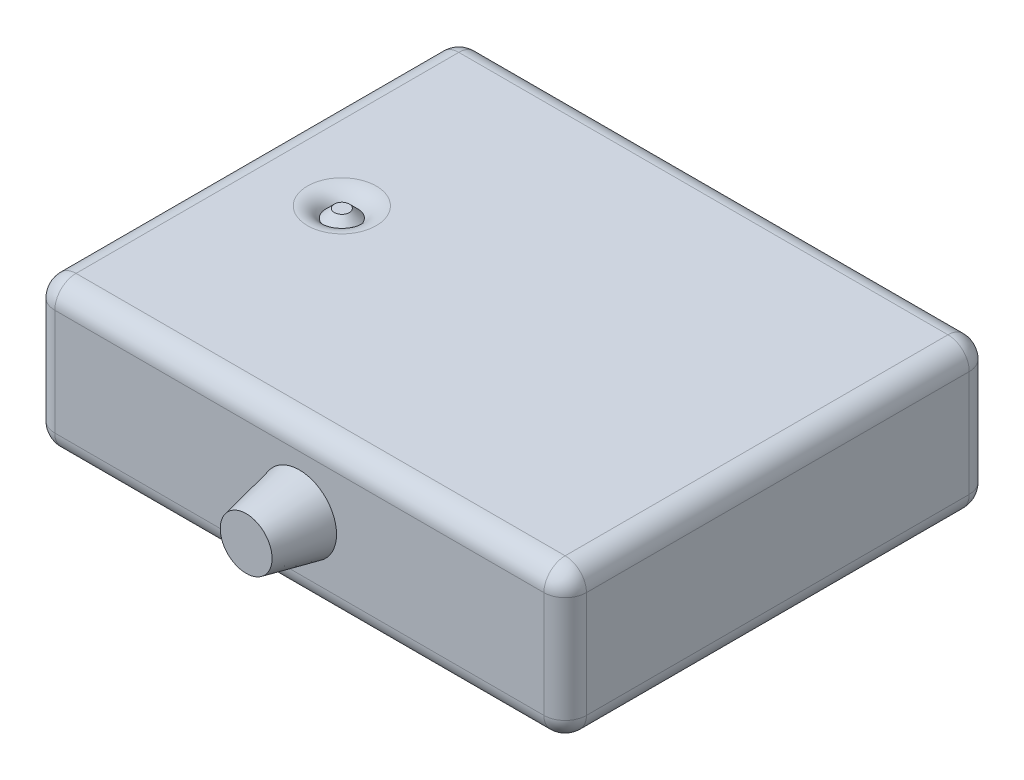
ISO-10303-21;
HEADER;
FILE_DESCRIPTION(('STEP AP214'),'2;1');
FILE_NAME('part.step','',(''),(''),'','','');
FILE_SCHEMA(('AUTOMOTIVE_DESIGN { 1 0 10303 214 1 1 1 1 }'));
ENDSEC;
DATA;
#1=APPLICATION_CONTEXT('core data for automotive mechanical design processes');
#2=APPLICATION_PROTOCOL_DEFINITION('international standard','automotive_design',2000,#1);
#3=PRODUCT_CONTEXT('',#1,'mechanical');
#4=PRODUCT('Part','Part','',(#3));
#5=PRODUCT_RELATED_PRODUCT_CATEGORY('part','',(#4));
#6=PRODUCT_DEFINITION_FORMATION('','',#4);
#7=PRODUCT_DEFINITION_CONTEXT('part definition',#1,'design');
#8=PRODUCT_DEFINITION('design','',#6,#7);
#9=PRODUCT_DEFINITION_SHAPE('','',#8);
#10=(LENGTH_UNIT() NAMED_UNIT(*) SI_UNIT(.MILLI.,.METRE.));
#11=(NAMED_UNIT(*) PLANE_ANGLE_UNIT() SI_UNIT($,.RADIAN.));
#12=(NAMED_UNIT(*) SI_UNIT($,.STERADIAN.) SOLID_ANGLE_UNIT());
#13=UNCERTAINTY_MEASURE_WITH_UNIT(LENGTH_MEASURE(1.E-05),#10,'distance_accuracy_value','');
#14=(GEOMETRIC_REPRESENTATION_CONTEXT(3) GLOBAL_UNCERTAINTY_ASSIGNED_CONTEXT((#13)) GLOBAL_UNIT_ASSIGNED_CONTEXT((#10,
#11,#12)) REPRESENTATION_CONTEXT('',''));
#15=CARTESIAN_POINT('',(0.,0.,0.));
#16=DIRECTION('',(0.,0.,1.));
#17=DIRECTION('',(1.,0.,0.));
#18=AXIS2_PLACEMENT_3D('',#15,#16,#17);
#19=CARTESIAN_POINT('',(0.,8.89,25.4));
#20=DIRECTION('',(0.,0.,-1.));
#21=DIRECTION('',(1.,0.,0.));
#22=AXIS2_PLACEMENT_3D('',#19,#20,#21);
#23=CONICAL_SURFACE('',#22,4.445,0.20943951023932);
#24=CARTESIAN_POINT('',(0.,8.89,31.75));
#25=DIRECTION('',(0.,0.,1.));
#26=DIRECTION('',(1.,0.,0.));
#27=AXIS2_PLACEMENT_3D('',#24,#25,#26);
#28=CIRCLE('',#27,3.09526583339536);
#29=CARTESIAN_POINT('',(3.09526583339536,8.89,31.75));
#30=VERTEX_POINT('',#29);
#31=EDGE_CURVE('E11',#30,#30,#28,.T.);
#32=ORIENTED_EDGE('',*,*,#31,.F.);
#33=EDGE_LOOP('',(#32));
#34=FACE_BOUND('',#33,.T.);
#35=CARTESIAN_POINT('',(0.,8.89,25.4));
#36=DIRECTION('',(0.,0.,1.));
#37=DIRECTION('',(1.,0.,0.));
#38=AXIS2_PLACEMENT_3D('',#35,#36,#37);
#39=CIRCLE('',#38,4.445);
#40=CARTESIAN_POINT('',(4.44500000000001,8.89,25.4));
#41=VERTEX_POINT('',#40);
#42=EDGE_CURVE('E50',#41,#41,#39,.T.);
#43=ORIENTED_EDGE('',*,*,#42,.T.);
#44=EDGE_LOOP('',(#43));
#45=FACE_BOUND('',#44,.T.);
#46=ADVANCED_FACE('F44',(#34,#45),#23,.T.);
#47=CARTESIAN_POINT('',(0.,8.89,31.75));
#48=DIRECTION('',(0.,0.,1.));
#49=DIRECTION('',(1.,0.,0.));
#50=AXIS2_PLACEMENT_3D('',#47,#48,#49);
#51=PLANE('',#50);
#52=ORIENTED_EDGE('',*,*,#31,.T.);
#53=EDGE_LOOP('',(#52));
#54=FACE_BOUND('',#53,.T.);
#55=ADVANCED_FACE('F59',(#54),#51,.T.);
#56=CARTESIAN_POINT('',(0.,8.89,25.4));
#57=DIRECTION('',(0.,0.,1.));
#58=DIRECTION('',(1.,0.,0.));
#59=AXIS2_PLACEMENT_3D('',#56,#57,#58);
#60=PLANE('',#59);
#61=ORIENTED_EDGE('',*,*,#42,.F.);
#62=EDGE_LOOP('',(#61));
#63=FACE_BOUND('',#62,.T.);
#64=ADVANCED_FACE('F57',(#63),#60,.F.);
#65=CLOSED_SHELL('',(#46,#55,#64));
#66=MANIFOLD_SOLID_BREP('B2',#65);
#67=CARTESIAN_POINT('',(31.75,17.78,-25.4));
#68=DIRECTION('',(-1.,0.,0.));
#69=DIRECTION('',(0.,0.,1.));
#70=AXIS2_PLACEMENT_3D('',#67,#68,#69);
#71=PLANE('',#70);
#72=DIRECTION('',(0.,0.,-1.));
#73=VECTOR('',#72,1.);
#74=CARTESIAN_POINT('',(31.75,15.24,25.4));
#75=LINE('',#74,#73);
#76=CARTESIAN_POINT('',(31.75,15.24,-22.86));
#77=VERTEX_POINT('',#76);
#78=CARTESIAN_POINT('',(31.75,15.24,22.86));
#79=VERTEX_POINT('',#78);
#80=EDGE_CURVE('E179',#77,#79,#75,.F.);
#81=ORIENTED_EDGE('',*,*,#80,.T.);
#82=DIRECTION('',(0.,-1.,0.));
#83=VECTOR('',#82,1.);
#84=CARTESIAN_POINT('',(31.75,17.78,22.86));
#85=LINE('',#84,#83);
#86=CARTESIAN_POINT('',(31.75,2.54,22.86));
#87=VERTEX_POINT('',#86);
#88=EDGE_CURVE('E237',#79,#87,#85,.T.);
#89=ORIENTED_EDGE('',*,*,#88,.T.);
#90=DIRECTION('',(0.,0.,-1.));
#91=VECTOR('',#90,1.);
#92=CARTESIAN_POINT('',(31.75,2.54,-25.4));
#93=LINE('',#92,#91);
#94=CARTESIAN_POINT('',(31.75,2.54,-22.86));
#95=VERTEX_POINT('',#94);
#96=EDGE_CURVE('E235',#87,#95,#93,.T.);
#97=ORIENTED_EDGE('',*,*,#96,.T.);
#98=DIRECTION('',(0.,-1.,0.));
#99=VECTOR('',#98,1.);
#100=CARTESIAN_POINT('',(31.75,17.78,-22.86));
#101=LINE('',#100,#99);
#102=EDGE_CURVE('E233',#95,#77,#101,.F.);
#103=ORIENTED_EDGE('',*,*,#102,.T.);
#104=EDGE_LOOP('',(#81,#89,#97,#103));
#105=FACE_BOUND('',#104,.T.);
#106=ADVANCED_FACE('F84',(#105),#71,.F.);
#107=CARTESIAN_POINT('',(-31.75,17.78,-25.4));
#108=DIRECTION('',(0.,0.,1.));
#109=DIRECTION('',(1.,0.,0.));
#110=AXIS2_PLACEMENT_3D('',#107,#108,#109);
#111=PLANE('',#110);
#112=DIRECTION('',(-1.,0.,0.));
#113=VECTOR('',#112,1.);
#114=CARTESIAN_POINT('',(31.75,15.24,-25.4));
#115=LINE('',#114,#113);
#116=CARTESIAN_POINT('',(-29.21,15.24,-25.4));
#117=VERTEX_POINT('',#116);
#118=CARTESIAN_POINT('',(29.21,15.24,-25.4));
#119=VERTEX_POINT('',#118);
#120=EDGE_CURVE('E308',#117,#119,#115,.F.);
#121=ORIENTED_EDGE('',*,*,#120,.T.);
#122=DIRECTION('',(0.,-1.,0.));
#123=VECTOR('',#122,1.);
#124=CARTESIAN_POINT('',(29.21,17.78,-25.4));
#125=LINE('',#124,#123);
#126=CARTESIAN_POINT('',(29.21,2.54,-25.4));
#127=VERTEX_POINT('',#126);
#128=EDGE_CURVE('E42',#119,#127,#125,.T.);
#129=ORIENTED_EDGE('',*,*,#128,.T.);
#130=DIRECTION('',(-1.,0.,0.));
#131=VECTOR('',#130,1.);
#132=CARTESIAN_POINT('',(-31.75,2.54,-25.4));
#133=LINE('',#132,#131);
#134=CARTESIAN_POINT('',(-29.21,2.54,-25.4));
#135=VERTEX_POINT('',#134);
#136=EDGE_CURVE('E93',#127,#135,#133,.T.);
#137=ORIENTED_EDGE('',*,*,#136,.T.);
#138=DIRECTION('',(0.,-1.,0.));
#139=VECTOR('',#138,1.);
#140=CARTESIAN_POINT('',(-29.21,17.78,-25.4));
#141=LINE('',#140,#139);
#142=EDGE_CURVE('E239',#135,#117,#141,.F.);
#143=ORIENTED_EDGE('',*,*,#142,.T.);
#144=EDGE_LOOP('',(#121,#129,#137,#143));
#145=FACE_BOUND('',#144,.T.);
#146=ADVANCED_FACE('F351',(#145),#111,.F.);
#147=CARTESIAN_POINT('',(-31.75,17.78,-25.4));
#148=DIRECTION('',(1.,0.,0.));
#149=DIRECTION('',(0.,0.,-1.));
#150=AXIS2_PLACEMENT_3D('',#147,#148,#149);
#151=PLANE('',#150);
#152=DIRECTION('',(0.,0.,1.));
#153=VECTOR('',#152,1.);
#154=CARTESIAN_POINT('',(-31.75,2.54,-25.4));
#155=LINE('',#154,#153);
#156=CARTESIAN_POINT('',(-31.75,2.54,-22.86));
#157=VERTEX_POINT('',#156);
#158=CARTESIAN_POINT('',(-31.75,2.54,22.86));
#159=VERTEX_POINT('',#158);
#160=EDGE_CURVE('E229',#157,#159,#155,.T.);
#161=ORIENTED_EDGE('',*,*,#160,.T.);
#162=DIRECTION('',(0.,-1.,0.));
#163=VECTOR('',#162,1.);
#164=CARTESIAN_POINT('',(-31.75,17.78,22.86));
#165=LINE('',#164,#163);
#166=CARTESIAN_POINT('',(-31.75,15.24,22.86));
#167=VERTEX_POINT('',#166);
#168=EDGE_CURVE('E231',#159,#167,#165,.F.);
#169=ORIENTED_EDGE('',*,*,#168,.T.);
#170=DIRECTION('',(0.,0.,1.));
#171=VECTOR('',#170,1.);
#172=CARTESIAN_POINT('',(-31.75,15.24,-25.4));
#173=LINE('',#172,#171);
#174=CARTESIAN_POINT('',(-31.75,15.24,-22.86));
#175=VERTEX_POINT('',#174);
#176=EDGE_CURVE('E304',#167,#175,#173,.F.);
#177=ORIENTED_EDGE('',*,*,#176,.T.);
#178=DIRECTION('',(0.,-1.,0.));
#179=VECTOR('',#178,1.);
#180=CARTESIAN_POINT('',(-31.75,17.78,-22.86));
#181=LINE('',#180,#179);
#182=EDGE_CURVE('E227',#175,#157,#181,.T.);
#183=ORIENTED_EDGE('',*,*,#182,.T.);
#184=EDGE_LOOP('',(#161,#169,#177,#183));
#185=FACE_BOUND('',#184,.T.);
#186=ADVANCED_FACE('F360',(#185),#151,.F.);
#187=CARTESIAN_POINT('',(-31.75,17.78,25.4));
#188=DIRECTION('',(0.,0.,-1.));
#189=DIRECTION('',(-1.,0.,0.));
#190=AXIS2_PLACEMENT_3D('',#187,#188,#189);
#191=PLANE('',#190);
#192=DIRECTION('',(1.,0.,0.));
#193=VECTOR('',#192,1.);
#194=CARTESIAN_POINT('',(-31.75,15.24,25.4));
#195=LINE('',#194,#193);
#196=CARTESIAN_POINT('',(29.21,15.24,25.4));
#197=VERTEX_POINT('',#196);
#198=CARTESIAN_POINT('',(-29.21,15.24,25.4));
#199=VERTEX_POINT('',#198);
#200=EDGE_CURVE('E301',#197,#199,#195,.F.);
#201=ORIENTED_EDGE('',*,*,#200,.T.);
#202=DIRECTION('',(0.,-1.,0.));
#203=VECTOR('',#202,1.);
#204=CARTESIAN_POINT('',(-29.21,17.78,25.4));
#205=LINE('',#204,#203);
#206=CARTESIAN_POINT('',(-29.21,2.54,25.4));
#207=VERTEX_POINT('',#206);
#208=EDGE_CURVE('E216',#199,#207,#205,.T.);
#209=ORIENTED_EDGE('',*,*,#208,.T.);
#210=DIRECTION('',(1.,0.,0.));
#211=VECTOR('',#210,1.);
#212=CARTESIAN_POINT('',(-31.75,2.54,25.4));
#213=LINE('',#212,#211);
#214=CARTESIAN_POINT('',(29.21,2.54,25.4));
#215=VERTEX_POINT('',#214);
#216=EDGE_CURVE('E210',#207,#215,#213,.T.);
#217=ORIENTED_EDGE('',*,*,#216,.T.);
#218=DIRECTION('',(0.,-1.,0.));
#219=VECTOR('',#218,1.);
#220=CARTESIAN_POINT('',(29.21,17.78,25.4));
#221=LINE('',#220,#219);
#222=EDGE_CURVE('E208',#215,#197,#221,.F.);
#223=ORIENTED_EDGE('',*,*,#222,.T.);
#224=EDGE_LOOP('',(#201,#209,#217,#223));
#225=FACE_BOUND('',#224,.T.);
#226=ADVANCED_FACE('F375',(#225),#191,.F.);
#227=CARTESIAN_POINT('',(0.,17.78,0.));
#228=DIRECTION('',(0.,1.,0.));
#229=DIRECTION('',(0.,0.,1.));
#230=AXIS2_PLACEMENT_3D('',#227,#228,#229);
#231=PLANE('',#230);
#232=DIRECTION('',(0.,0.,1.));
#233=VECTOR('',#232,1.);
#234=CARTESIAN_POINT('',(-29.21,17.78,25.4));
#235=LINE('',#234,#233);
#236=CARTESIAN_POINT('',(-29.21,17.78,-22.86));
#237=VERTEX_POINT('',#236);
#238=CARTESIAN_POINT('',(-29.21,17.78,22.86));
#239=VERTEX_POINT('',#238);
#240=EDGE_CURVE('E198',#237,#239,#235,.T.);
#241=ORIENTED_EDGE('',*,*,#240,.T.);
#242=DIRECTION('',(1.,0.,0.));
#243=VECTOR('',#242,1.);
#244=CARTESIAN_POINT('',(31.75,17.78,22.86));
#245=LINE('',#244,#243);
#246=CARTESIAN_POINT('',(29.21,17.78,22.86));
#247=VERTEX_POINT('',#246);
#248=EDGE_CURVE('E196',#239,#247,#245,.T.);
#249=ORIENTED_EDGE('',*,*,#248,.T.);
#250=DIRECTION('',(0.,0.,-1.));
#251=VECTOR('',#250,1.);
#252=CARTESIAN_POINT('',(29.21,17.78,-25.4));
#253=LINE('',#252,#251);
#254=CARTESIAN_POINT('',(29.21,17.78,-22.86));
#255=VERTEX_POINT('',#254);
#256=EDGE_CURVE('E176',#247,#255,#253,.T.);
#257=ORIENTED_EDGE('',*,*,#256,.T.);
#258=DIRECTION('',(-1.,0.,0.));
#259=VECTOR('',#258,1.);
#260=CARTESIAN_POINT('',(-31.75,17.78,-22.86));
#261=LINE('',#260,#259);
#262=EDGE_CURVE('E193',#255,#237,#261,.T.);
#263=ORIENTED_EDGE('',*,*,#262,.T.);
#264=EDGE_LOOP('',(#241,#249,#257,#263));
#265=FACE_BOUND('',#264,.T.);
#266=CARTESIAN_POINT('',(-20.32,17.78,0.));
#267=DIRECTION('',(0.,1.,0.));
#268=DIRECTION('',(0.,0.,1.));
#269=AXIS2_PLACEMENT_3D('',#266,#267,#268);
#270=CIRCLE('',#269,4.10470452561247);
#271=CARTESIAN_POINT('',(-20.32,17.78,4.10470452561247));
#272=VERTEX_POINT('',#271);
#273=EDGE_CURVE('E206',#272,#272,#270,.F.);
#274=ORIENTED_EDGE('',*,*,#273,.T.);
#275=EDGE_LOOP('',(#274));
#276=FACE_BOUND('',#275,.T.);
#277=ADVANCED_FACE('F191',(#265,#276),#231,.T.);
#278=CARTESIAN_POINT('',(0.,0.,0.));
#279=DIRECTION('',(0.,1.,0.));
#280=DIRECTION('',(0.,0.,1.));
#281=AXIS2_PLACEMENT_3D('',#278,#279,#280);
#282=PLANE('',#281);
#283=DIRECTION('',(0.,0.,-1.));
#284=VECTOR('',#283,1.);
#285=CARTESIAN_POINT('',(29.21,0.,0.));
#286=LINE('',#285,#284);
#287=CARTESIAN_POINT('',(29.21,0.,-22.86));
#288=VERTEX_POINT('',#287);
#289=CARTESIAN_POINT('',(29.21,0.,22.86));
#290=VERTEX_POINT('',#289);
#291=EDGE_CURVE('E220',#288,#290,#286,.F.);
#292=ORIENTED_EDGE('',*,*,#291,.T.);
#293=DIRECTION('',(1.,0.,0.));
#294=VECTOR('',#293,1.);
#295=CARTESIAN_POINT('',(0.,0.,22.86));
#296=LINE('',#295,#294);
#297=CARTESIAN_POINT('',(-29.21,0.,22.86));
#298=VERTEX_POINT('',#297);
#299=EDGE_CURVE('E224',#290,#298,#296,.F.);
#300=ORIENTED_EDGE('',*,*,#299,.T.);
#301=DIRECTION('',(0.,0.,1.));
#302=VECTOR('',#301,1.);
#303=CARTESIAN_POINT('',(-29.21,0.,0.));
#304=LINE('',#303,#302);
#305=CARTESIAN_POINT('',(-29.21,0.,-22.86));
#306=VERTEX_POINT('',#305);
#307=EDGE_CURVE('E222',#298,#306,#304,.F.);
#308=ORIENTED_EDGE('',*,*,#307,.T.);
#309=DIRECTION('',(-1.,0.,0.));
#310=VECTOR('',#309,1.);
#311=CARTESIAN_POINT('',(0.,0.,-22.86));
#312=LINE('',#311,#310);
#313=EDGE_CURVE('E218',#306,#288,#312,.F.);
#314=ORIENTED_EDGE('',*,*,#313,.T.);
#315=EDGE_LOOP('',(#292,#300,#308,#314));
#316=FACE_BOUND('',#315,.T.);
#317=ADVANCED_FACE('F386',(#316),#282,.F.);
#318=CARTESIAN_POINT('',(-20.32,16.51,0.));
#319=DIRECTION('',(0.,-1.,0.));
#320=DIRECTION('',(0.,0.,1.));
#321=AXIS2_PLACEMENT_3D('',#318,#319,#320);
#322=CONICAL_SURFACE('',#321,1.905,0.78539816339745);
#323=CARTESIAN_POINT('',(-20.32,17.526,0.));
#324=DIRECTION('',(0.,1.,0.));
#325=DIRECTION('',(0.,0.,1.));
#326=AXIS2_PLACEMENT_3D('',#323,#324,#325);
#327=CIRCLE('',#326,0.888999999999997);
#328=CARTESIAN_POINT('',(-20.32,17.526,0.888999999999996));
#329=VERTEX_POINT('',#328);
#330=EDGE_CURVE('E286',#329,#329,#327,.T.);
#331=ORIENTED_EDGE('',*,*,#330,.F.);
#332=EDGE_LOOP('',(#331));
#333=FACE_BOUND('',#332,.T.);
#334=CARTESIAN_POINT('',(-20.32,16.51,0.));
#335=DIRECTION('',(0.,1.,0.));
#336=DIRECTION('',(0.,0.,1.));
#337=AXIS2_PLACEMENT_3D('',#334,#335,#336);
#338=CIRCLE('',#337,1.905);
#339=CARTESIAN_POINT('',(-20.32,16.51,1.905));
#340=VERTEX_POINT('',#339);
#341=EDGE_CURVE('E290',#340,#340,#338,.T.);
#342=ORIENTED_EDGE('',*,*,#341,.T.);
#343=EDGE_LOOP('',(#342));
#344=FACE_BOUND('',#343,.T.);
#345=ADVANCED_FACE('F388',(#333,#344),#322,.T.);
#346=CARTESIAN_POINT('',(-20.32,17.526,0.));
#347=DIRECTION('',(0.,1.,0.));
#348=DIRECTION('',(0.,0.,1.));
#349=AXIS2_PLACEMENT_3D('',#346,#347,#348);
#350=PLANE('',#349);
#351=ORIENTED_EDGE('',*,*,#330,.T.);
#352=EDGE_LOOP('',(#351));
#353=FACE_BOUND('',#352,.T.);
#354=ADVANCED_FACE('F394',(#353),#350,.T.);
#355=CARTESIAN_POINT('',(0.,15.24,-22.86));
#356=DIRECTION('',(1.,0.,0.));
#357=DIRECTION('',(0.,0.,-1.));
#358=AXIS2_PLACEMENT_3D('',#355,#356,#357);
#359=CYLINDRICAL_SURFACE('',#358,2.54);
#360=ORIENTED_EDGE('',*,*,#262,.F.);
#361=CARTESIAN_POINT('',(29.21,15.24,-22.86));
#362=DIRECTION('',(1.,0.,0.));
#363=DIRECTION('',(0.,0.,-1.));
#364=AXIS2_PLACEMENT_3D('',#361,#362,#363);
#365=CIRCLE('',#364,2.54);
#366=EDGE_CURVE('E203',#255,#119,#365,.F.);
#367=ORIENTED_EDGE('',*,*,#366,.T.);
#368=ORIENTED_EDGE('',*,*,#120,.F.);
#369=CARTESIAN_POINT('',(-29.21,15.24,-22.86));
#370=DIRECTION('',(1.,0.,0.));
#371=DIRECTION('',(0.,0.,-1.));
#372=AXIS2_PLACEMENT_3D('',#369,#370,#371);
#373=CIRCLE('',#372,2.54);
#374=EDGE_CURVE('E205',#117,#237,#373,.T.);
#375=ORIENTED_EDGE('',*,*,#374,.T.);
#376=EDGE_LOOP('',(#360,#367,#368,#375));
#377=FACE_BOUND('',#376,.T.);
#378=ADVANCED_FACE('F201',(#377),#359,.T.);
#379=CARTESIAN_POINT('',(-29.21,15.24,0.));
#380=DIRECTION('',(0.,0.,-1.));
#381=DIRECTION('',(-1.,0.,0.));
#382=AXIS2_PLACEMENT_3D('',#379,#380,#381);
#383=CYLINDRICAL_SURFACE('',#382,2.54);
#384=ORIENTED_EDGE('',*,*,#176,.F.);
#385=CARTESIAN_POINT('',(-29.21,15.24,22.86));
#386=DIRECTION('',(0.,0.,-1.));
#387=DIRECTION('',(-1.,0.,0.));
#388=AXIS2_PLACEMENT_3D('',#385,#386,#387);
#389=CIRCLE('',#388,2.54);
#390=EDGE_CURVE('E185',#167,#239,#389,.T.);
#391=ORIENTED_EDGE('',*,*,#390,.T.);
#392=ORIENTED_EDGE('',*,*,#240,.F.);
#393=CARTESIAN_POINT('',(-29.21,15.24,-22.86));
#394=DIRECTION('',(0.,0.,-1.));
#395=DIRECTION('',(-1.,0.,0.));
#396=AXIS2_PLACEMENT_3D('',#393,#394,#395);
#397=CIRCLE('',#396,2.54);
#398=EDGE_CURVE('E315',#237,#175,#397,.F.);
#399=ORIENTED_EDGE('',*,*,#398,.T.);
#400=EDGE_LOOP('',(#384,#391,#392,#399));
#401=FACE_BOUND('',#400,.T.);
#402=ADVANCED_FACE('F357',(#401),#383,.T.);
#403=CARTESIAN_POINT('',(29.21,15.24,0.));
#404=DIRECTION('',(0.,0.,1.));
#405=DIRECTION('',(1.,0.,0.));
#406=AXIS2_PLACEMENT_3D('',#403,#404,#405);
#407=CYLINDRICAL_SURFACE('',#406,2.54);
#408=ORIENTED_EDGE('',*,*,#256,.F.);
#409=CARTESIAN_POINT('',(29.21,15.24,22.86));
#410=DIRECTION('',(0.,0.,1.));
#411=DIRECTION('',(1.,0.,0.));
#412=AXIS2_PLACEMENT_3D('',#409,#410,#411);
#413=CIRCLE('',#412,2.54);
#414=EDGE_CURVE('E184',#247,#79,#413,.F.);
#415=ORIENTED_EDGE('',*,*,#414,.T.);
#416=ORIENTED_EDGE('',*,*,#80,.F.);
#417=CARTESIAN_POINT('',(29.21,15.24,-22.86));
#418=DIRECTION('',(0.,0.,1.));
#419=DIRECTION('',(1.,0.,0.));
#420=AXIS2_PLACEMENT_3D('',#417,#418,#419);
#421=CIRCLE('',#420,2.54);
#422=EDGE_CURVE('E173',#77,#255,#421,.T.);
#423=ORIENTED_EDGE('',*,*,#422,.T.);
#424=EDGE_LOOP('',(#408,#415,#416,#423));
#425=FACE_BOUND('',#424,.T.);
#426=ADVANCED_FACE('F175',(#425),#407,.T.);
#427=CARTESIAN_POINT('',(0.,15.24,22.86));
#428=DIRECTION('',(-1.,0.,0.));
#429=DIRECTION('',(0.,0.,1.));
#430=AXIS2_PLACEMENT_3D('',#427,#428,#429);
#431=CYLINDRICAL_SURFACE('',#430,2.54);
#432=ORIENTED_EDGE('',*,*,#248,.F.);
#433=CARTESIAN_POINT('',(-29.21,15.24,22.86));
#434=DIRECTION('',(-1.,0.,0.));
#435=DIRECTION('',(0.,0.,1.));
#436=AXIS2_PLACEMENT_3D('',#433,#434,#435);
#437=CIRCLE('',#436,2.54);
#438=EDGE_CURVE('E312',#239,#199,#437,.F.);
#439=ORIENTED_EDGE('',*,*,#438,.T.);
#440=ORIENTED_EDGE('',*,*,#200,.F.);
#441=CARTESIAN_POINT('',(29.21,15.24,22.86));
#442=DIRECTION('',(-1.,0.,0.));
#443=DIRECTION('',(0.,0.,1.));
#444=AXIS2_PLACEMENT_3D('',#441,#442,#443);
#445=CIRCLE('',#444,2.54);
#446=EDGE_CURVE('E310',#197,#247,#445,.T.);
#447=ORIENTED_EDGE('',*,*,#446,.T.);
#448=EDGE_LOOP('',(#432,#439,#440,#447));
#449=FACE_BOUND('',#448,.T.);
#450=ADVANCED_FACE('F372',(#449),#431,.T.);
#451=CARTESIAN_POINT('',(-20.32,15.24,0.));
#452=DIRECTION('',(0.,1.,0.));
#453=DIRECTION('',(0.,0.,1.));
#454=AXIS2_PLACEMENT_3D('',#451,#452,#453);
#455=TOROIDAL_SURFACE('',#454,4.10470452561247,2.54);
#456=ORIENTED_EDGE('',*,*,#273,.F.);
#457=EDGE_LOOP('',(#456));
#458=FACE_BOUND('',#457,.T.);
#459=ORIENTED_EDGE('',*,*,#341,.F.);
#460=EDGE_LOOP('',(#459));
#461=FACE_BOUND('',#460,.T.);
#462=ADVANCED_FACE('F409',(#458,#461),#455,.T.);
#463=CARTESIAN_POINT('',(29.21,15.24,-22.86));
#464=DIRECTION('',(0.,0.,1.));
#465=DIRECTION('',(1.,0.,0.));
#466=AXIS2_PLACEMENT_3D('',#463,#464,#465);
#467=SPHERICAL_SURFACE('',#466,2.54);
#468=ORIENTED_EDGE('',*,*,#366,.F.);
#469=ORIENTED_EDGE('',*,*,#422,.F.);
#470=CARTESIAN_POINT('',(29.21,15.24,-22.86));
#471=DIRECTION('',(0.,-1.,0.));
#472=DIRECTION('',(0.,0.,-1.));
#473=AXIS2_PLACEMENT_3D('',#470,#471,#472);
#474=CIRCLE('',#473,2.54);
#475=EDGE_CURVE('E88',#119,#77,#474,.T.);
#476=ORIENTED_EDGE('',*,*,#475,.F.);
#477=EDGE_LOOP('',(#468,#469,#476));
#478=FACE_BOUND('',#477,.T.);
#479=ADVANCED_FACE('F86',(#478),#467,.T.);
#480=CARTESIAN_POINT('',(29.21,17.78,-22.86));
#481=DIRECTION('',(0.,-1.,0.));
#482=DIRECTION('',(0.,0.,-1.));
#483=AXIS2_PLACEMENT_3D('',#480,#481,#482);
#484=CYLINDRICAL_SURFACE('',#483,2.54);
#485=ORIENTED_EDGE('',*,*,#475,.T.);
#486=ORIENTED_EDGE('',*,*,#102,.F.);
#487=CARTESIAN_POINT('',(29.21,2.54,-22.86));
#488=DIRECTION('',(0.,-1.,0.));
#489=DIRECTION('',(0.,0.,-1.));
#490=AXIS2_PLACEMENT_3D('',#487,#488,#489);
#491=CIRCLE('',#490,2.54);
#492=EDGE_CURVE('E281',#127,#95,#491,.T.);
#493=ORIENTED_EDGE('',*,*,#492,.F.);
#494=ORIENTED_EDGE('',*,*,#128,.F.);
#495=EDGE_LOOP('',(#485,#486,#493,#494));
#496=FACE_BOUND('',#495,.T.);
#497=ADVANCED_FACE('F336',(#496),#484,.T.);
#498=CARTESIAN_POINT('',(29.21,15.24,22.86));
#499=DIRECTION('',(0.,0.,1.));
#500=DIRECTION('',(1.,0.,0.));
#501=AXIS2_PLACEMENT_3D('',#498,#499,#500);
#502=SPHERICAL_SURFACE('',#501,2.54);
#503=ORIENTED_EDGE('',*,*,#414,.F.);
#504=ORIENTED_EDGE('',*,*,#446,.F.);
#505=CARTESIAN_POINT('',(29.21,15.24,22.86));
#506=DIRECTION('',(0.,-1.,0.));
#507=DIRECTION('',(0.,0.,-1.));
#508=AXIS2_PLACEMENT_3D('',#505,#506,#507);
#509=CIRCLE('',#508,2.54);
#510=EDGE_CURVE('E279',#79,#197,#509,.T.);
#511=ORIENTED_EDGE('',*,*,#510,.F.);
#512=EDGE_LOOP('',(#503,#504,#511));
#513=FACE_BOUND('',#512,.T.);
#514=ADVANCED_FACE('F323',(#513),#502,.T.);
#515=CARTESIAN_POINT('',(29.21,2.54,-22.86));
#516=DIRECTION('',(0.,0.,1.));
#517=DIRECTION('',(1.,0.,0.));
#518=AXIS2_PLACEMENT_3D('',#515,#516,#517);
#519=SPHERICAL_SURFACE('',#518,2.54);
#520=CARTESIAN_POINT('',(29.21,2.54,-22.86));
#521=DIRECTION('',(1.,0.,0.));
#522=DIRECTION('',(0.,0.,-1.));
#523=AXIS2_PLACEMENT_3D('',#520,#521,#522);
#524=CIRCLE('',#523,2.54);
#525=EDGE_CURVE('E273',#127,#288,#524,.F.);
#526=ORIENTED_EDGE('',*,*,#525,.F.);
#527=ORIENTED_EDGE('',*,*,#492,.T.);
#528=CARTESIAN_POINT('',(29.21,2.54,-22.86));
#529=DIRECTION('',(0.,0.,-1.));
#530=DIRECTION('',(-1.,0.,0.));
#531=AXIS2_PLACEMENT_3D('',#528,#529,#530);
#532=CIRCLE('',#531,2.54);
#533=EDGE_CURVE('E276',#288,#95,#532,.F.);
#534=ORIENTED_EDGE('',*,*,#533,.F.);
#535=EDGE_LOOP('',(#526,#527,#534));
#536=FACE_BOUND('',#535,.T.);
#537=ADVANCED_FACE('F337',(#536),#519,.T.);
#538=CARTESIAN_POINT('',(-29.21,15.24,-22.86));
#539=DIRECTION('',(0.,0.,1.));
#540=DIRECTION('',(1.,0.,0.));
#541=AXIS2_PLACEMENT_3D('',#538,#539,#540);
#542=SPHERICAL_SURFACE('',#541,2.54);
#543=ORIENTED_EDGE('',*,*,#398,.F.);
#544=ORIENTED_EDGE('',*,*,#374,.F.);
#545=CARTESIAN_POINT('',(-29.21,15.24,-22.86));
#546=DIRECTION('',(0.,-1.,0.));
#547=DIRECTION('',(0.,0.,-1.));
#548=AXIS2_PLACEMENT_3D('',#545,#546,#547);
#549=CIRCLE('',#548,2.54);
#550=EDGE_CURVE('E270',#175,#117,#549,.T.);
#551=ORIENTED_EDGE('',*,*,#550,.F.);
#552=EDGE_LOOP('',(#543,#544,#551));
#553=FACE_BOUND('',#552,.T.);
#554=ADVANCED_FACE('F354',(#553),#542,.T.);
#555=CARTESIAN_POINT('',(29.21,17.78,22.86));
#556=DIRECTION('',(0.,-1.,0.));
#557=DIRECTION('',(0.,0.,-1.));
#558=AXIS2_PLACEMENT_3D('',#555,#556,#557);
#559=CYLINDRICAL_SURFACE('',#558,2.54);
#560=ORIENTED_EDGE('',*,*,#510,.T.);
#561=ORIENTED_EDGE('',*,*,#222,.F.);
#562=CARTESIAN_POINT('',(29.21,2.54,22.86));
#563=DIRECTION('',(0.,-1.,0.));
#564=DIRECTION('',(0.,0.,-1.));
#565=AXIS2_PLACEMENT_3D('',#562,#563,#564);
#566=CIRCLE('',#565,2.54);
#567=EDGE_CURVE('E267',#87,#215,#566,.T.);
#568=ORIENTED_EDGE('',*,*,#567,.F.);
#569=ORIENTED_EDGE('',*,*,#88,.F.);
#570=EDGE_LOOP('',(#560,#561,#568,#569));
#571=FACE_BOUND('',#570,.T.);
#572=ADVANCED_FACE('F327',(#571),#559,.T.);
#573=CARTESIAN_POINT('',(29.21,2.54,-25.4));
#574=DIRECTION('',(0.,0.,-1.));
#575=DIRECTION('',(-1.,0.,0.));
#576=AXIS2_PLACEMENT_3D('',#573,#574,#575);
#577=CYLINDRICAL_SURFACE('',#576,2.54);
#578=ORIENTED_EDGE('',*,*,#533,.T.);
#579=ORIENTED_EDGE('',*,*,#96,.F.);
#580=CARTESIAN_POINT('',(29.21,2.54,22.86));
#581=DIRECTION('',(0.,0.,1.));
#582=DIRECTION('',(1.,0.,0.));
#583=AXIS2_PLACEMENT_3D('',#580,#581,#582);
#584=CIRCLE('',#583,2.54);
#585=EDGE_CURVE('E264',#290,#87,#584,.T.);
#586=ORIENTED_EDGE('',*,*,#585,.F.);
#587=ORIENTED_EDGE('',*,*,#291,.F.);
#588=EDGE_LOOP('',(#578,#579,#586,#587));
#589=FACE_BOUND('',#588,.T.);
#590=ADVANCED_FACE('F335',(#589),#577,.T.);
#591=CARTESIAN_POINT('',(-31.75,2.54,-22.86));
#592=DIRECTION('',(-1.,0.,0.));
#593=DIRECTION('',(0.,0.,1.));
#594=AXIS2_PLACEMENT_3D('',#591,#592,#593);
#595=CYLINDRICAL_SURFACE('',#594,2.54);
#596=ORIENTED_EDGE('',*,*,#525,.T.);
#597=ORIENTED_EDGE('',*,*,#313,.F.);
#598=CARTESIAN_POINT('',(-29.21,2.54,-22.86));
#599=DIRECTION('',(-1.,0.,0.));
#600=DIRECTION('',(0.,0.,1.));
#601=AXIS2_PLACEMENT_3D('',#598,#599,#600);
#602=CIRCLE('',#601,2.54);
#603=EDGE_CURVE('E261',#135,#306,#602,.T.);
#604=ORIENTED_EDGE('',*,*,#603,.F.);
#605=ORIENTED_EDGE('',*,*,#136,.F.);
#606=EDGE_LOOP('',(#596,#597,#604,#605));
#607=FACE_BOUND('',#606,.T.);
#608=ADVANCED_FACE('F341',(#607),#595,.T.);
#609=CARTESIAN_POINT('',(-29.21,17.78,-22.86));
#610=DIRECTION('',(0.,-1.,0.));
#611=DIRECTION('',(0.,0.,-1.));
#612=AXIS2_PLACEMENT_3D('',#609,#610,#611);
#613=CYLINDRICAL_SURFACE('',#612,2.54);
#614=ORIENTED_EDGE('',*,*,#550,.T.);
#615=ORIENTED_EDGE('',*,*,#142,.F.);
#616=CARTESIAN_POINT('',(-29.21,2.54,-22.86));
#617=DIRECTION('',(0.,-1.,0.));
#618=DIRECTION('',(0.,0.,-1.));
#619=AXIS2_PLACEMENT_3D('',#616,#617,#618);
#620=CIRCLE('',#619,2.54);
#621=EDGE_CURVE('E258',#157,#135,#620,.T.);
#622=ORIENTED_EDGE('',*,*,#621,.F.);
#623=ORIENTED_EDGE('',*,*,#182,.F.);
#624=EDGE_LOOP('',(#614,#615,#622,#623));
#625=FACE_BOUND('',#624,.T.);
#626=ADVANCED_FACE('F349',(#625),#613,.T.);
#627=CARTESIAN_POINT('',(29.21,2.54,22.86));
#628=DIRECTION('',(0.,0.,1.));
#629=DIRECTION('',(1.,0.,0.));
#630=AXIS2_PLACEMENT_3D('',#627,#628,#629);
#631=SPHERICAL_SURFACE('',#630,2.54);
#632=ORIENTED_EDGE('',*,*,#585,.T.);
#633=ORIENTED_EDGE('',*,*,#567,.T.);
#634=CARTESIAN_POINT('',(29.21,2.54,22.86));
#635=DIRECTION('',(1.,0.,0.));
#636=DIRECTION('',(0.,0.,-1.));
#637=AXIS2_PLACEMENT_3D('',#634,#635,#636);
#638=CIRCLE('',#637,2.54);
#639=EDGE_CURVE('E255',#290,#215,#638,.F.);
#640=ORIENTED_EDGE('',*,*,#639,.F.);
#641=EDGE_LOOP('',(#632,#633,#640));
#642=FACE_BOUND('',#641,.T.);
#643=ADVANCED_FACE('F331',(#642),#631,.T.);
#644=CARTESIAN_POINT('',(-29.21,2.54,-22.86));
#645=DIRECTION('',(0.,0.,1.));
#646=DIRECTION('',(1.,0.,0.));
#647=AXIS2_PLACEMENT_3D('',#644,#645,#646);
#648=SPHERICAL_SURFACE('',#647,2.54);
#649=ORIENTED_EDGE('',*,*,#621,.T.);
#650=ORIENTED_EDGE('',*,*,#603,.T.);
#651=CARTESIAN_POINT('',(-29.21,2.54,-22.86));
#652=DIRECTION('',(0.,0.,-1.));
#653=DIRECTION('',(-1.,0.,0.));
#654=AXIS2_PLACEMENT_3D('',#651,#652,#653);
#655=CIRCLE('',#654,2.54);
#656=EDGE_CURVE('E252',#157,#306,#655,.F.);
#657=ORIENTED_EDGE('',*,*,#656,.F.);
#658=EDGE_LOOP('',(#649,#650,#657));
#659=FACE_BOUND('',#658,.T.);
#660=ADVANCED_FACE('F345',(#659),#648,.T.);
#661=CARTESIAN_POINT('',(-31.75,2.54,22.86));
#662=DIRECTION('',(1.,0.,0.));
#663=DIRECTION('',(0.,0.,-1.));
#664=AXIS2_PLACEMENT_3D('',#661,#662,#663);
#665=CYLINDRICAL_SURFACE('',#664,2.54);
#666=ORIENTED_EDGE('',*,*,#639,.T.);
#667=ORIENTED_EDGE('',*,*,#216,.F.);
#668=CARTESIAN_POINT('',(-29.21,2.54,22.86));
#669=DIRECTION('',(-1.,0.,0.));
#670=DIRECTION('',(0.,0.,1.));
#671=AXIS2_PLACEMENT_3D('',#668,#669,#670);
#672=CIRCLE('',#671,2.54);
#673=EDGE_CURVE('E249',#298,#207,#672,.T.);
#674=ORIENTED_EDGE('',*,*,#673,.F.);
#675=ORIENTED_EDGE('',*,*,#299,.F.);
#676=EDGE_LOOP('',(#666,#667,#674,#675));
#677=FACE_BOUND('',#676,.T.);
#678=ADVANCED_FACE('F379',(#677),#665,.T.);
#679=CARTESIAN_POINT('',(-29.21,2.54,-25.4));
#680=DIRECTION('',(0.,0.,1.));
#681=DIRECTION('',(1.,0.,0.));
#682=AXIS2_PLACEMENT_3D('',#679,#680,#681);
#683=CYLINDRICAL_SURFACE('',#682,2.54);
#684=ORIENTED_EDGE('',*,*,#656,.T.);
#685=ORIENTED_EDGE('',*,*,#307,.F.);
#686=CARTESIAN_POINT('',(-29.21,2.54,22.86));
#687=DIRECTION('',(0.,0.,1.));
#688=DIRECTION('',(1.,0.,0.));
#689=AXIS2_PLACEMENT_3D('',#686,#687,#688);
#690=CIRCLE('',#689,2.54);
#691=EDGE_CURVE('E247',#159,#298,#690,.T.);
#692=ORIENTED_EDGE('',*,*,#691,.F.);
#693=ORIENTED_EDGE('',*,*,#160,.F.);
#694=EDGE_LOOP('',(#684,#685,#692,#693));
#695=FACE_BOUND('',#694,.T.);
#696=ADVANCED_FACE('F384',(#695),#683,.T.);
#697=CARTESIAN_POINT('',(-29.21,2.54,22.86));
#698=DIRECTION('',(0.,0.,1.));
#699=DIRECTION('',(1.,0.,0.));
#700=AXIS2_PLACEMENT_3D('',#697,#698,#699);
#701=SPHERICAL_SURFACE('',#700,2.54);
#702=ORIENTED_EDGE('',*,*,#691,.T.);
#703=ORIENTED_EDGE('',*,*,#673,.T.);
#704=CARTESIAN_POINT('',(-29.21,2.54,22.86));
#705=DIRECTION('',(0.,-1.,0.));
#706=DIRECTION('',(0.,0.,-1.));
#707=AXIS2_PLACEMENT_3D('',#704,#705,#706);
#708=CIRCLE('',#707,2.54);
#709=EDGE_CURVE('E244',#159,#207,#708,.F.);
#710=ORIENTED_EDGE('',*,*,#709,.F.);
#711=EDGE_LOOP('',(#702,#703,#710));
#712=FACE_BOUND('',#711,.T.);
#713=ADVANCED_FACE('F382',(#712),#701,.T.);
#714=CARTESIAN_POINT('',(-29.21,17.78,22.86));
#715=DIRECTION('',(0.,-1.,0.));
#716=DIRECTION('',(0.,0.,-1.));
#717=AXIS2_PLACEMENT_3D('',#714,#715,#716);
#718=CYLINDRICAL_SURFACE('',#717,2.54);
#719=ORIENTED_EDGE('',*,*,#709,.T.);
#720=ORIENTED_EDGE('',*,*,#208,.F.);
#721=CARTESIAN_POINT('',(-29.21,15.24,22.86));
#722=DIRECTION('',(0.,1.,0.));
#723=DIRECTION('',(0.,0.,1.));
#724=AXIS2_PLACEMENT_3D('',#721,#722,#723);
#725=CIRCLE('',#724,2.54);
#726=EDGE_CURVE('E242',#167,#199,#725,.T.);
#727=ORIENTED_EDGE('',*,*,#726,.F.);
#728=ORIENTED_EDGE('',*,*,#168,.F.);
#729=EDGE_LOOP('',(#719,#720,#727,#728));
#730=FACE_BOUND('',#729,.T.);
#731=ADVANCED_FACE('F365',(#730),#718,.T.);
#732=CARTESIAN_POINT('',(-29.21,15.24,22.86));
#733=DIRECTION('',(0.,0.,1.));
#734=DIRECTION('',(1.,0.,0.));
#735=AXIS2_PLACEMENT_3D('',#732,#733,#734);
#736=SPHERICAL_SURFACE('',#735,2.54);
#737=ORIENTED_EDGE('',*,*,#438,.F.);
#738=ORIENTED_EDGE('',*,*,#390,.F.);
#739=ORIENTED_EDGE('',*,*,#726,.T.);
#740=EDGE_LOOP('',(#737,#738,#739));
#741=FACE_BOUND('',#740,.T.);
#742=ADVANCED_FACE('F370',(#741),#736,.T.);
#743=CLOSED_SHELL('',(#106,#146,#186,#226,#277,#317,#345,#354,#378,#402,#426,#450,#462,#479,
#497,#514,#537,#554,#572,#590,#608,#626,#643,#660,#678,#696,#713,#731,#742));
#744=MANIFOLD_SOLID_BREP('B6',#743);
#745=ADVANCED_BREP_SHAPE_REPRESENTATION('',(#18,#66,#744),#14);
#746=SHAPE_DEFINITION_REPRESENTATION(#9,#745);
ENDSEC;
END-ISO-10303-21;
